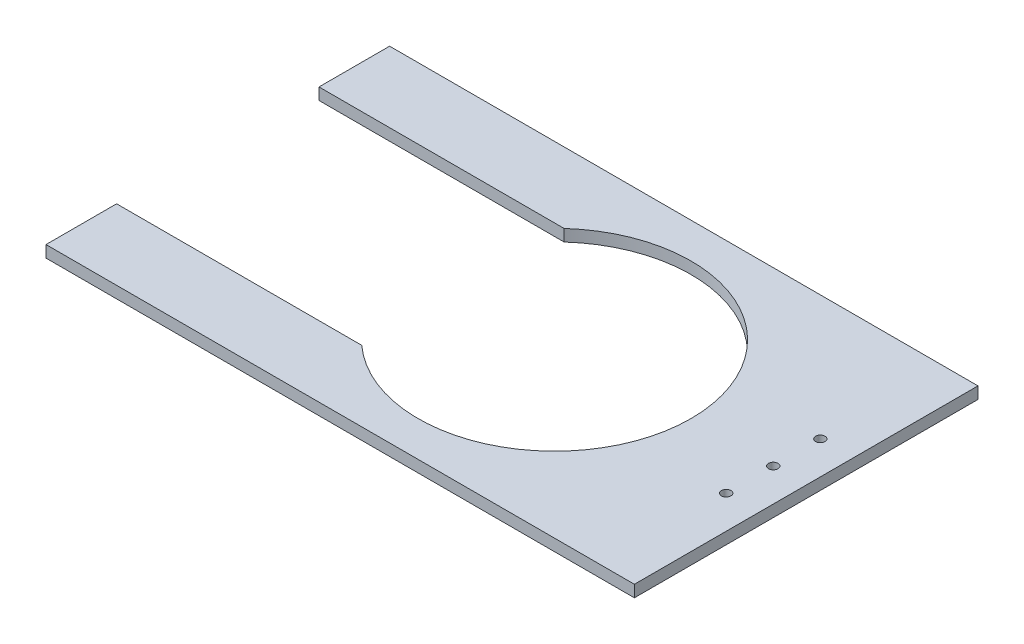
ISO-10303-21;
HEADER;
FILE_DESCRIPTION(('STEP AP214'),'2;1');
FILE_NAME('part.step','',(''),(''),'','','');
FILE_SCHEMA(('AUTOMOTIVE_DESIGN { 1 0 10303 214 1 1 1 1 }'));
ENDSEC;
DATA;
#1=APPLICATION_CONTEXT('core data for automotive mechanical design processes');
#2=APPLICATION_PROTOCOL_DEFINITION('international standard','automotive_design',2000,#1);
#3=PRODUCT_CONTEXT('',#1,'mechanical');
#4=PRODUCT('Part','Part','',(#3));
#5=PRODUCT_RELATED_PRODUCT_CATEGORY('part','',(#4));
#6=PRODUCT_DEFINITION_FORMATION('','',#4);
#7=PRODUCT_DEFINITION_CONTEXT('part definition',#1,'design');
#8=PRODUCT_DEFINITION('design','',#6,#7);
#9=PRODUCT_DEFINITION_SHAPE('','',#8);
#10=(LENGTH_UNIT() NAMED_UNIT(*) SI_UNIT(.MILLI.,.METRE.));
#11=(NAMED_UNIT(*) PLANE_ANGLE_UNIT() SI_UNIT($,.RADIAN.));
#12=(NAMED_UNIT(*) SI_UNIT($,.STERADIAN.) SOLID_ANGLE_UNIT());
#13=UNCERTAINTY_MEASURE_WITH_UNIT(LENGTH_MEASURE(1.E-05),#10,'distance_accuracy_value','');
#14=(GEOMETRIC_REPRESENTATION_CONTEXT(3) GLOBAL_UNCERTAINTY_ASSIGNED_CONTEXT((#13)) GLOBAL_UNIT_ASSIGNED_CONTEXT((#10,
#11,#12)) REPRESENTATION_CONTEXT('',''));
#15=CARTESIAN_POINT('',(0.,0.,0.));
#16=DIRECTION('',(0.,0.,1.));
#17=DIRECTION('',(1.,0.,0.));
#18=AXIS2_PLACEMENT_3D('',#15,#16,#17);
#19=CARTESIAN_POINT('',(-85.5943890254375,5.,63.));
#20=DIRECTION('',(0.,1.,0.));
#21=DIRECTION('',(0.,0.,1.));
#22=AXIS2_PLACEMENT_3D('',#19,#20,#21);
#23=PLANE('',#22);
#24=CARTESIAN_POINT('',(7.33623013074512,5.,43.0000000000002));
#25=DIRECTION('',(0.,1.,0.));
#26=DIRECTION('',(0.,0.,1.));
#27=AXIS2_PLACEMENT_3D('',#24,#25,#26);
#28=CIRCLE('',#27,2.);
#29=CARTESIAN_POINT('',(7.33623013074512,5.,45.0000000000002));
#30=VERTEX_POINT('',#29);
#31=EDGE_CURVE('E182',#30,#30,#28,.T.);
#32=ORIENTED_EDGE('',*,*,#31,.F.);
#33=EDGE_LOOP('',(#32));
#34=FACE_BOUND('',#33,.T.);
#35=DIRECTION('',(0.,0.,1.));
#36=VECTOR('',#35,1.);
#37=CARTESIAN_POINT('',(-228.663769869255,5.,-10.));
#38=LINE('',#37,#36);
#39=CARTESIAN_POINT('',(-228.663769869255,5.,-10.));
#40=VERTEX_POINT('',#39);
#41=CARTESIAN_POINT('',(-228.663769869255,5.,20.));
#42=VERTEX_POINT('',#41);
#43=EDGE_CURVE('E147',#40,#42,#38,.T.);
#44=ORIENTED_EDGE('',*,*,#43,.T.);
#45=DIRECTION('',(1.,0.,0.));
#46=VECTOR('',#45,1.);
#47=CARTESIAN_POINT('',(-228.663769869255,5.,20.));
#48=LINE('',#47,#46);
#49=CARTESIAN_POINT('',(-124.517389937495,5.,20.));
#50=VERTEX_POINT('',#49);
#51=EDGE_CURVE('E90',#42,#50,#48,.T.);
#52=ORIENTED_EDGE('',*,*,#51,.T.);
#53=CARTESIAN_POINT('',(-85.5943890254375,5.,63.));
#54=DIRECTION('',(0.,-1.,0.));
#55=DIRECTION('',(0.,0.,1.));
#56=AXIS2_PLACEMENT_3D('',#53,#54,#55);
#57=CIRCLE('',#56,58.);
#58=CARTESIAN_POINT('',(-124.517389937495,5.,106.));
#59=VERTEX_POINT('',#58);
#60=EDGE_CURVE('E162',#50,#59,#57,.T.);
#61=ORIENTED_EDGE('',*,*,#60,.T.);
#62=DIRECTION('',(-1.,0.,0.));
#63=VECTOR('',#62,1.);
#64=CARTESIAN_POINT('',(-228.663769869255,5.,106.));
#65=LINE('',#64,#63);
#66=CARTESIAN_POINT('',(-228.663769869255,5.,106.));
#67=VERTEX_POINT('',#66);
#68=EDGE_CURVE('E173',#59,#67,#65,.T.);
#69=ORIENTED_EDGE('',*,*,#68,.T.);
#70=DIRECTION('',(0.,0.,1.));
#71=VECTOR('',#70,1.);
#72=CARTESIAN_POINT('',(-228.663769869255,5.,136.));
#73=LINE('',#72,#71);
#74=CARTESIAN_POINT('',(-228.663769869255,5.,136.));
#75=VERTEX_POINT('',#74);
#76=EDGE_CURVE('E110',#67,#75,#73,.T.);
#77=ORIENTED_EDGE('',*,*,#76,.T.);
#78=DIRECTION('',(1.,0.,0.));
#79=VECTOR('',#78,1.);
#80=CARTESIAN_POINT('',(-228.663769869255,5.,136.));
#81=LINE('',#80,#79);
#82=CARTESIAN_POINT('',(21.3362301307451,5.,136.));
#83=VERTEX_POINT('',#82);
#84=EDGE_CURVE('E103',#75,#83,#81,.T.);
#85=ORIENTED_EDGE('',*,*,#84,.T.);
#86=DIRECTION('',(0.,0.,-1.));
#87=VECTOR('',#86,1.);
#88=CARTESIAN_POINT('',(21.3362301307451,5.,106.));
#89=LINE('',#88,#87);
#90=CARTESIAN_POINT('',(21.3362301307451,5.,-10.));
#91=VERTEX_POINT('',#90);
#92=EDGE_CURVE('E107',#83,#91,#89,.T.);
#93=ORIENTED_EDGE('',*,*,#92,.T.);
#94=DIRECTION('',(-1.,0.,0.));
#95=VECTOR('',#94,1.);
#96=CARTESIAN_POINT('',(-118.663769869255,5.,-10.));
#97=LINE('',#96,#95);
#98=EDGE_CURVE('E50',#91,#40,#97,.T.);
#99=ORIENTED_EDGE('',*,*,#98,.T.);
#100=EDGE_LOOP('',(#44,#52,#61,#69,#77,#85,#93,#99));
#101=FACE_BOUND('',#100,.T.);
#102=CARTESIAN_POINT('',(7.33623013074675,5.,63.0000000000056));
#103=DIRECTION('',(0.,1.,0.));
#104=DIRECTION('',(0.,0.,1.));
#105=AXIS2_PLACEMENT_3D('',#102,#103,#104);
#106=CIRCLE('',#105,2.00000000000001);
#107=CARTESIAN_POINT('',(7.33623013074675,5.,65.0000000000057));
#108=VERTEX_POINT('',#107);
#109=EDGE_CURVE('E134',#108,#108,#106,.T.);
#110=ORIENTED_EDGE('',*,*,#109,.F.);
#111=EDGE_LOOP('',(#110));
#112=FACE_BOUND('',#111,.T.);
#113=CARTESIAN_POINT('',(7.33623013074512,5.,83.0000000000003));
#114=DIRECTION('',(0.,1.,0.));
#115=DIRECTION('',(0.,0.,1.));
#116=AXIS2_PLACEMENT_3D('',#113,#114,#115);
#117=CIRCLE('',#116,1.99999999999997);
#118=CARTESIAN_POINT('',(7.33623013074512,5.,85.0000000000002));
#119=VERTEX_POINT('',#118);
#120=EDGE_CURVE('E188',#119,#119,#117,.T.);
#121=ORIENTED_EDGE('',*,*,#120,.F.);
#122=EDGE_LOOP('',(#121));
#123=FACE_BOUND('',#122,.T.);
#124=ADVANCED_FACE('F33',(#34,#101,#112,#123),#23,.T.);
#125=CARTESIAN_POINT('',(-85.5943890254375,0.,63.));
#126=DIRECTION('',(0.,1.,0.));
#127=DIRECTION('',(0.,0.,1.));
#128=AXIS2_PLACEMENT_3D('',#125,#126,#127);
#129=PLANE('',#128);
#130=DIRECTION('',(0.,0.,1.));
#131=VECTOR('',#130,1.);
#132=CARTESIAN_POINT('',(-228.663769869255,0.,-10.));
#133=LINE('',#132,#131);
#134=CARTESIAN_POINT('',(-228.663769869255,0.,-10.));
#135=VERTEX_POINT('',#134);
#136=CARTESIAN_POINT('',(-228.663769869255,0.,20.));
#137=VERTEX_POINT('',#136);
#138=EDGE_CURVE('E130',#135,#137,#133,.T.);
#139=ORIENTED_EDGE('',*,*,#138,.F.);
#140=DIRECTION('',(-1.,0.,0.));
#141=VECTOR('',#140,1.);
#142=CARTESIAN_POINT('',(-228.663769869255,0.,-10.));
#143=LINE('',#142,#141);
#144=CARTESIAN_POINT('',(21.3362301307451,0.,-10.));
#145=VERTEX_POINT('',#144);
#146=EDGE_CURVE('E78',#145,#135,#143,.T.);
#147=ORIENTED_EDGE('',*,*,#146,.F.);
#148=DIRECTION('',(0.,0.,-1.));
#149=VECTOR('',#148,1.);
#150=CARTESIAN_POINT('',(21.3362301307451,0.,106.));
#151=LINE('',#150,#149);
#152=CARTESIAN_POINT('',(21.3362301307451,0.,136.));
#153=VERTEX_POINT('',#152);
#154=EDGE_CURVE('E144',#153,#145,#151,.T.);
#155=ORIENTED_EDGE('',*,*,#154,.F.);
#156=DIRECTION('',(1.,0.,0.));
#157=VECTOR('',#156,1.);
#158=CARTESIAN_POINT('',(-118.663769869255,0.,136.));
#159=LINE('',#158,#157);
#160=CARTESIAN_POINT('',(-228.663769869255,0.,136.));
#161=VERTEX_POINT('',#160);
#162=EDGE_CURVE('E119',#161,#153,#159,.T.);
#163=ORIENTED_EDGE('',*,*,#162,.F.);
#164=DIRECTION('',(0.,0.,1.));
#165=VECTOR('',#164,1.);
#166=CARTESIAN_POINT('',(-228.663769869255,0.,136.));
#167=LINE('',#166,#165);
#168=CARTESIAN_POINT('',(-228.663769869255,0.,106.));
#169=VERTEX_POINT('',#168);
#170=EDGE_CURVE('E140',#169,#161,#167,.T.);
#171=ORIENTED_EDGE('',*,*,#170,.F.);
#172=DIRECTION('',(-1.,0.,0.));
#173=VECTOR('',#172,1.);
#174=CARTESIAN_POINT('',(-228.663769869255,0.,106.));
#175=LINE('',#174,#173);
#176=CARTESIAN_POINT('',(-124.517389937495,0.,106.));
#177=VERTEX_POINT('',#176);
#178=EDGE_CURVE('E138',#177,#169,#175,.T.);
#179=ORIENTED_EDGE('',*,*,#178,.F.);
#180=CARTESIAN_POINT('',(-85.5943890254375,0.,63.));
#181=DIRECTION('',(0.,-1.,0.));
#182=DIRECTION('',(0.,0.,1.));
#183=AXIS2_PLACEMENT_3D('',#180,#181,#182);
#184=CIRCLE('',#183,58.);
#185=CARTESIAN_POINT('',(-124.517389937495,0.,20.));
#186=VERTEX_POINT('',#185);
#187=EDGE_CURVE('E136',#186,#177,#184,.T.);
#188=ORIENTED_EDGE('',*,*,#187,.F.);
#189=DIRECTION('',(1.,0.,0.));
#190=VECTOR('',#189,1.);
#191=CARTESIAN_POINT('',(-228.663769869255,0.,20.));
#192=LINE('',#191,#190);
#193=EDGE_CURVE('E133',#137,#186,#192,.T.);
#194=ORIENTED_EDGE('',*,*,#193,.F.);
#195=EDGE_LOOP('',(#139,#147,#155,#163,#171,#179,#188,#194));
#196=FACE_BOUND('',#195,.T.);
#197=CARTESIAN_POINT('',(7.33623013074675,0.,63.0000000000056));
#198=DIRECTION('',(0.,1.,0.));
#199=DIRECTION('',(0.,0.,1.));
#200=AXIS2_PLACEMENT_3D('',#197,#198,#199);
#201=CIRCLE('',#200,2.00000000000001);
#202=CARTESIAN_POINT('',(7.33623013074675,0.,65.0000000000057));
#203=VERTEX_POINT('',#202);
#204=EDGE_CURVE('E179',#203,#203,#201,.T.);
#205=ORIENTED_EDGE('',*,*,#204,.T.);
#206=EDGE_LOOP('',(#205));
#207=FACE_BOUND('',#206,.T.);
#208=CARTESIAN_POINT('',(7.33623013074512,0.,43.0000000000002));
#209=DIRECTION('',(0.,1.,0.));
#210=DIRECTION('',(0.,0.,1.));
#211=AXIS2_PLACEMENT_3D('',#208,#209,#210);
#212=CIRCLE('',#211,2.);
#213=CARTESIAN_POINT('',(7.33623013074512,0.,45.0000000000002));
#214=VERTEX_POINT('',#213);
#215=EDGE_CURVE('E185',#214,#214,#212,.T.);
#216=ORIENTED_EDGE('',*,*,#215,.T.);
#217=EDGE_LOOP('',(#216));
#218=FACE_BOUND('',#217,.T.);
#219=CARTESIAN_POINT('',(7.33623013074512,0.,83.0000000000003));
#220=DIRECTION('',(0.,1.,0.));
#221=DIRECTION('',(0.,0.,1.));
#222=AXIS2_PLACEMENT_3D('',#219,#220,#221);
#223=CIRCLE('',#222,1.99999999999997);
#224=CARTESIAN_POINT('',(7.33623013074512,0.,85.0000000000002));
#225=VERTEX_POINT('',#224);
#226=EDGE_CURVE('E191',#225,#225,#223,.T.);
#227=ORIENTED_EDGE('',*,*,#226,.T.);
#228=EDGE_LOOP('',(#227));
#229=FACE_BOUND('',#228,.T.);
#230=ADVANCED_FACE('F164',(#196,#207,#218,#229),#129,.F.);
#231=CARTESIAN_POINT('',(-228.663769869255,5.,-10.));
#232=DIRECTION('',(1.,0.,0.));
#233=DIRECTION('',(0.,0.,-1.));
#234=AXIS2_PLACEMENT_3D('',#231,#232,#233);
#235=PLANE('',#234);
#236=ORIENTED_EDGE('',*,*,#138,.T.);
#237=DIRECTION('',(0.,-1.,0.));
#238=VECTOR('',#237,1.);
#239=CARTESIAN_POINT('',(-228.663769869255,5.,20.));
#240=LINE('',#239,#238);
#241=EDGE_CURVE('E11',#42,#137,#240,.T.);
#242=ORIENTED_EDGE('',*,*,#241,.F.);
#243=ORIENTED_EDGE('',*,*,#43,.F.);
#244=DIRECTION('',(0.,-1.,0.));
#245=VECTOR('',#244,1.);
#246=CARTESIAN_POINT('',(-228.663769869255,5.,-10.));
#247=LINE('',#246,#245);
#248=EDGE_CURVE('E126',#40,#135,#247,.T.);
#249=ORIENTED_EDGE('',*,*,#248,.T.);
#250=EDGE_LOOP('',(#236,#242,#243,#249));
#251=FACE_BOUND('',#250,.T.);
#252=ADVANCED_FACE('F35',(#251),#235,.F.);
#253=CARTESIAN_POINT('',(-228.663769869255,5.,20.));
#254=DIRECTION('',(0.,0.,-1.));
#255=DIRECTION('',(-1.,0.,0.));
#256=AXIS2_PLACEMENT_3D('',#253,#254,#255);
#257=PLANE('',#256);
#258=ORIENTED_EDGE('',*,*,#193,.T.);
#259=DIRECTION('',(0.,-1.,0.));
#260=VECTOR('',#259,1.);
#261=CARTESIAN_POINT('',(-124.517389937495,5.,20.));
#262=LINE('',#261,#260);
#263=EDGE_CURVE('E42',#50,#186,#262,.T.);
#264=ORIENTED_EDGE('',*,*,#263,.F.);
#265=ORIENTED_EDGE('',*,*,#51,.F.);
#266=ORIENTED_EDGE('',*,*,#241,.T.);
#267=EDGE_LOOP('',(#258,#264,#265,#266));
#268=FACE_BOUND('',#267,.T.);
#269=ADVANCED_FACE('F224',(#268),#257,.F.);
#270=CARTESIAN_POINT('',(-85.5943890254375,5.,63.));
#271=DIRECTION('',(0.,-1.,0.));
#272=DIRECTION('',(0.,0.,-1.));
#273=AXIS2_PLACEMENT_3D('',#270,#271,#272);
#274=CYLINDRICAL_SURFACE('',#273,58.);
#275=ORIENTED_EDGE('',*,*,#187,.T.);
#276=DIRECTION('',(0.,-1.,0.));
#277=VECTOR('',#276,1.);
#278=CARTESIAN_POINT('',(-124.517389937495,5.,106.));
#279=LINE('',#278,#277);
#280=EDGE_CURVE('E154',#59,#177,#279,.T.);
#281=ORIENTED_EDGE('',*,*,#280,.F.);
#282=ORIENTED_EDGE('',*,*,#60,.F.);
#283=ORIENTED_EDGE('',*,*,#263,.T.);
#284=EDGE_LOOP('',(#275,#281,#282,#283));
#285=FACE_BOUND('',#284,.T.);
#286=ADVANCED_FACE('F160',(#285),#274,.F.);
#287=CARTESIAN_POINT('',(-228.663769869255,5.,106.));
#288=DIRECTION('',(0.,0.,1.));
#289=DIRECTION('',(1.,0.,0.));
#290=AXIS2_PLACEMENT_3D('',#287,#288,#289);
#291=PLANE('',#290);
#292=ORIENTED_EDGE('',*,*,#178,.T.);
#293=DIRECTION('',(0.,-1.,0.));
#294=VECTOR('',#293,1.);
#295=CARTESIAN_POINT('',(-228.663769869255,5.,106.));
#296=LINE('',#295,#294);
#297=EDGE_CURVE('E151',#67,#169,#296,.T.);
#298=ORIENTED_EDGE('',*,*,#297,.F.);
#299=ORIENTED_EDGE('',*,*,#68,.F.);
#300=ORIENTED_EDGE('',*,*,#280,.T.);
#301=EDGE_LOOP('',(#292,#298,#299,#300));
#302=FACE_BOUND('',#301,.T.);
#303=ADVANCED_FACE('F169',(#302),#291,.F.);
#304=CARTESIAN_POINT('',(-228.663769869255,5.,136.));
#305=DIRECTION('',(1.,0.,0.));
#306=DIRECTION('',(0.,0.,-1.));
#307=AXIS2_PLACEMENT_3D('',#304,#305,#306);
#308=PLANE('',#307);
#309=ORIENTED_EDGE('',*,*,#170,.T.);
#310=DIRECTION('',(0.,-1.,0.));
#311=VECTOR('',#310,1.);
#312=CARTESIAN_POINT('',(-228.663769869255,5.,136.));
#313=LINE('',#312,#311);
#314=EDGE_CURVE('E121',#75,#161,#313,.T.);
#315=ORIENTED_EDGE('',*,*,#314,.F.);
#316=ORIENTED_EDGE('',*,*,#76,.F.);
#317=ORIENTED_EDGE('',*,*,#297,.T.);
#318=EDGE_LOOP('',(#309,#315,#316,#317));
#319=FACE_BOUND('',#318,.T.);
#320=ADVANCED_FACE('F172',(#319),#308,.F.);
#321=CARTESIAN_POINT('',(-118.663769869255,5.,136.));
#322=DIRECTION('',(0.,0.,-1.));
#323=DIRECTION('',(-1.,0.,0.));
#324=AXIS2_PLACEMENT_3D('',#321,#322,#323);
#325=PLANE('',#324);
#326=ORIENTED_EDGE('',*,*,#162,.T.);
#327=DIRECTION('',(0.,-1.,0.));
#328=VECTOR('',#327,1.);
#329=CARTESIAN_POINT('',(21.3362301307451,5.,136.));
#330=LINE('',#329,#328);
#331=EDGE_CURVE('E117',#83,#153,#330,.T.);
#332=ORIENTED_EDGE('',*,*,#331,.F.);
#333=ORIENTED_EDGE('',*,*,#84,.F.);
#334=ORIENTED_EDGE('',*,*,#314,.T.);
#335=EDGE_LOOP('',(#326,#332,#333,#334));
#336=FACE_BOUND('',#335,.T.);
#337=ADVANCED_FACE('F118',(#336),#325,.F.);
#338=CARTESIAN_POINT('',(21.3362301307451,5.,106.));
#339=DIRECTION('',(-1.,0.,0.));
#340=DIRECTION('',(0.,0.,1.));
#341=AXIS2_PLACEMENT_3D('',#338,#339,#340);
#342=PLANE('',#341);
#343=ORIENTED_EDGE('',*,*,#154,.T.);
#344=DIRECTION('',(0.,-1.,0.));
#345=VECTOR('',#344,1.);
#346=CARTESIAN_POINT('',(21.3362301307451,5.,-10.));
#347=LINE('',#346,#345);
#348=EDGE_CURVE('E122',#91,#145,#347,.T.);
#349=ORIENTED_EDGE('',*,*,#348,.F.);
#350=ORIENTED_EDGE('',*,*,#92,.F.);
#351=ORIENTED_EDGE('',*,*,#331,.T.);
#352=EDGE_LOOP('',(#343,#349,#350,#351));
#353=FACE_BOUND('',#352,.T.);
#354=ADVANCED_FACE('F124',(#353),#342,.F.);
#355=CARTESIAN_POINT('',(-228.663769869255,5.,-10.));
#356=DIRECTION('',(0.,0.,1.));
#357=DIRECTION('',(1.,0.,0.));
#358=AXIS2_PLACEMENT_3D('',#355,#356,#357);
#359=PLANE('',#358);
#360=ORIENTED_EDGE('',*,*,#146,.T.);
#361=ORIENTED_EDGE('',*,*,#248,.F.);
#362=ORIENTED_EDGE('',*,*,#98,.F.);
#363=ORIENTED_EDGE('',*,*,#348,.T.);
#364=EDGE_LOOP('',(#360,#361,#362,#363));
#365=FACE_BOUND('',#364,.T.);
#366=ADVANCED_FACE('F212',(#365),#359,.F.);
#367=CARTESIAN_POINT('',(7.33623013074675,5.,63.0000000000056));
#368=DIRECTION('',(0.,-1.,0.));
#369=DIRECTION('',(0.,0.,-1.));
#370=AXIS2_PLACEMENT_3D('',#367,#368,#369);
#371=CYLINDRICAL_SURFACE('',#370,2.00000000000001);
#372=ORIENTED_EDGE('',*,*,#109,.T.);
#373=EDGE_LOOP('',(#372));
#374=FACE_BOUND('',#373,.T.);
#375=ORIENTED_EDGE('',*,*,#204,.F.);
#376=EDGE_LOOP('',(#375));
#377=FACE_BOUND('',#376,.T.);
#378=ADVANCED_FACE('F209',(#374,#377),#371,.F.);
#379=CARTESIAN_POINT('',(7.33623013074512,5.,43.0000000000002));
#380=DIRECTION('',(0.,-1.,0.));
#381=DIRECTION('',(0.,0.,-1.));
#382=AXIS2_PLACEMENT_3D('',#379,#380,#381);
#383=CYLINDRICAL_SURFACE('',#382,2.);
#384=ORIENTED_EDGE('',*,*,#31,.T.);
#385=EDGE_LOOP('',(#384));
#386=FACE_BOUND('',#385,.T.);
#387=ORIENTED_EDGE('',*,*,#215,.F.);
#388=EDGE_LOOP('',(#387));
#389=FACE_BOUND('',#388,.T.);
#390=ADVANCED_FACE('F303',(#386,#389),#383,.F.);
#391=CARTESIAN_POINT('',(7.33623013074512,5.,83.0000000000003));
#392=DIRECTION('',(0.,-1.,0.));
#393=DIRECTION('',(0.,0.,-1.));
#394=AXIS2_PLACEMENT_3D('',#391,#392,#393);
#395=CYLINDRICAL_SURFACE('',#394,1.99999999999997);
#396=ORIENTED_EDGE('',*,*,#120,.T.);
#397=EDGE_LOOP('',(#396));
#398=FACE_BOUND('',#397,.T.);
#399=ORIENTED_EDGE('',*,*,#226,.F.);
#400=EDGE_LOOP('',(#399));
#401=FACE_BOUND('',#400,.T.);
#402=ADVANCED_FACE('F197',(#398,#401),#395,.F.);
#403=CLOSED_SHELL('',(#124,#230,#252,#269,#286,#303,#320,#337,#354,#366,#378,#390,#402));
#404=MANIFOLD_SOLID_BREP('B2',#403);
#405=ADVANCED_BREP_SHAPE_REPRESENTATION('',(#18,#404),#14);
#406=SHAPE_DEFINITION_REPRESENTATION(#9,#405);
ENDSEC;
END-ISO-10303-21;
